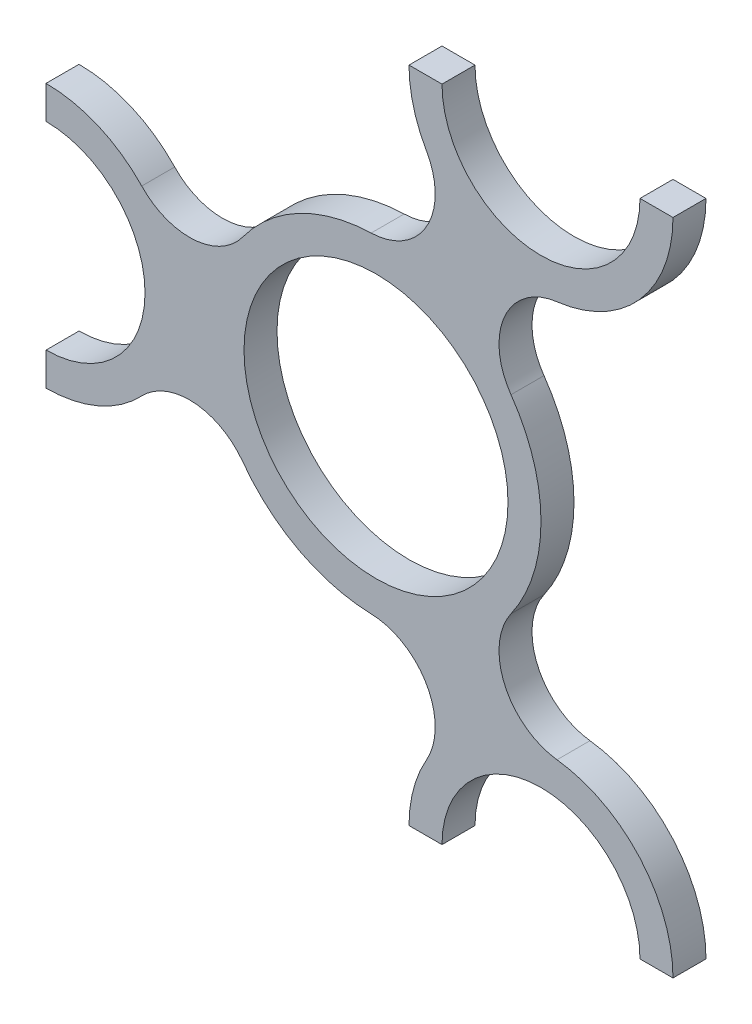
ISO-10303-21;
HEADER;
FILE_DESCRIPTION(('STEP AP214'),'2;1');
FILE_NAME('part.step','',(''),(''),'','','');
FILE_SCHEMA(('AUTOMOTIVE_DESIGN { 1 0 10303 214 1 1 1 1 }'));
ENDSEC;
DATA;
#1=APPLICATION_CONTEXT('core data for automotive mechanical design processes');
#2=APPLICATION_PROTOCOL_DEFINITION('international standard','automotive_design',2000,#1);
#3=PRODUCT_CONTEXT('',#1,'mechanical');
#4=PRODUCT('Part','Part','',(#3));
#5=PRODUCT_RELATED_PRODUCT_CATEGORY('part','',(#4));
#6=PRODUCT_DEFINITION_FORMATION('','',#4);
#7=PRODUCT_DEFINITION_CONTEXT('part definition',#1,'design');
#8=PRODUCT_DEFINITION('design','',#6,#7);
#9=PRODUCT_DEFINITION_SHAPE('','',#8);
#10=(LENGTH_UNIT() NAMED_UNIT(*) SI_UNIT(.MILLI.,.METRE.));
#11=(NAMED_UNIT(*) PLANE_ANGLE_UNIT() SI_UNIT($,.RADIAN.));
#12=(NAMED_UNIT(*) SI_UNIT($,.STERADIAN.) SOLID_ANGLE_UNIT());
#13=UNCERTAINTY_MEASURE_WITH_UNIT(LENGTH_MEASURE(1.E-05),#10,'distance_accuracy_value','');
#14=(GEOMETRIC_REPRESENTATION_CONTEXT(3) GLOBAL_UNCERTAINTY_ASSIGNED_CONTEXT((#13)) GLOBAL_UNIT_ASSIGNED_CONTEXT((#10,
#11,#12)) REPRESENTATION_CONTEXT('',''));
#15=CARTESIAN_POINT('',(0.,0.,0.));
#16=DIRECTION('',(0.,0.,1.));
#17=DIRECTION('',(1.,0.,0.));
#18=AXIS2_PLACEMENT_3D('',#15,#16,#17);
#19=CARTESIAN_POINT('',(-100.,0.,10.));
#20=DIRECTION('',(0.,0.,1.));
#21=DIRECTION('',(1.,0.,0.));
#22=AXIS2_PLACEMENT_3D('',#19,#20,#21);
#23=PLANE('',#22);
#24=CARTESIAN_POINT('',(-100.,0.,10.));
#25=DIRECTION('',(0.,0.,-1.));
#26=DIRECTION('',(1.,0.,0.));
#27=AXIS2_PLACEMENT_3D('',#24,#25,#26);
#28=CIRCLE('',#27,30.);
#29=CARTESIAN_POINT('',(-100.,30.,10.));
#30=VERTEX_POINT('',#29);
#31=CARTESIAN_POINT('',(-99.9999999999997,-30.,10.));
#32=VERTEX_POINT('',#31);
#33=EDGE_CURVE('E279',#30,#32,#28,.T.);
#34=ORIENTED_EDGE('',*,*,#33,.T.);
#35=DIRECTION('',(0.,-1.,0.));
#36=VECTOR('',#35,1.);
#37=CARTESIAN_POINT('',(-99.9999999999996,-40.,10.));
#38=LINE('',#37,#36);
#39=CARTESIAN_POINT('',(-99.9999999999996,-40.,10.));
#40=VERTEX_POINT('',#39);
#41=EDGE_CURVE('E147',#32,#40,#38,.T.);
#42=ORIENTED_EDGE('',*,*,#41,.T.);
#43=CARTESIAN_POINT('',(-100.,0.,10.));
#44=DIRECTION('',(0.,0.,1.));
#45=DIRECTION('',(1.,0.,0.));
#46=AXIS2_PLACEMENT_3D('',#43,#44,#45);
#47=CIRCLE('',#46,40.);
#48=CARTESIAN_POINT('',(-71.,-27.5499546279118,10.));
#49=VERTEX_POINT('',#48);
#50=EDGE_CURVE('E342',#40,#49,#47,.T.);
#51=ORIENTED_EDGE('',*,*,#50,.T.);
#52=CARTESIAN_POINT('',(-56.5,-41.3249319418677,10.));
#53=DIRECTION('',(0.,0.,-1.));
#54=DIRECTION('',(1.,0.,0.));
#55=AXIS2_PLACEMENT_3D('',#52,#53,#54);
#56=CIRCLE('',#55,20.);
#57=CARTESIAN_POINT('',(-40.3571428571429,-29.5178085299055,10.));
#58=VERTEX_POINT('',#57);
#59=EDGE_CURVE('E361',#49,#58,#56,.T.);
#60=ORIENTED_EDGE('',*,*,#59,.T.);
#61=CARTESIAN_POINT('',(0.,0.,10.));
#62=DIRECTION('',(0.,0.,1.));
#63=DIRECTION('',(1.,0.,0.));
#64=AXIS2_PLACEMENT_3D('',#61,#62,#63);
#65=CIRCLE('',#64,50.);
#66=CARTESIAN_POINT('',(-1.47081145952459,-49.9783624546716,10.));
#67=VERTEX_POINT('',#66);
#68=EDGE_CURVE('E358',#58,#67,#65,.T.);
#69=ORIENTED_EDGE('',*,*,#68,.T.);
#70=CARTESIAN_POINT('',(-2.0591360433344,-69.9697074365403,10.));
#71=DIRECTION('',(0.,0.,-1.));
#72=DIRECTION('',(1.,0.,0.));
#73=AXIS2_PLACEMENT_3D('',#70,#71,#72);
#74=CIRCLE('',#73,20.);
#75=CARTESIAN_POINT('',(15.2939093044437,-79.9131382910269,10.));
#76=VERTEX_POINT('',#75);
#77=EDGE_CURVE('E360',#67,#76,#74,.T.);
#78=ORIENTED_EDGE('',*,*,#77,.T.);
#79=CARTESIAN_POINT('',(50.,-99.8,10.));
#80=DIRECTION('',(0.,0.,1.));
#81=DIRECTION('',(1.,0.,0.));
#82=AXIS2_PLACEMENT_3D('',#79,#80,#81);
#83=CIRCLE('',#82,40.);
#84=CARTESIAN_POINT('',(10.,-99.8000000000003,10.));
#85=VERTEX_POINT('',#84);
#86=EDGE_CURVE('E363',#76,#85,#83,.T.);
#87=ORIENTED_EDGE('',*,*,#86,.T.);
#88=DIRECTION('',(1.,0.,0.));
#89=VECTOR('',#88,1.);
#90=CARTESIAN_POINT('',(10.,-99.8000000000003,10.));
#91=LINE('',#90,#89);
#92=CARTESIAN_POINT('',(20.,-99.8000000000002,10.));
#93=VERTEX_POINT('',#92);
#94=EDGE_CURVE('E369',#85,#93,#91,.T.);
#95=ORIENTED_EDGE('',*,*,#94,.T.);
#96=CARTESIAN_POINT('',(50.,-99.8,10.));
#97=DIRECTION('',(0.,0.,-1.));
#98=DIRECTION('',(1.,0.,0.));
#99=AXIS2_PLACEMENT_3D('',#96,#97,#98);
#100=CIRCLE('',#99,30.);
#101=CARTESIAN_POINT('',(80.,-99.8000000000001,10.));
#102=VERTEX_POINT('',#101);
#103=EDGE_CURVE('E371',#93,#102,#100,.T.);
#104=ORIENTED_EDGE('',*,*,#103,.T.);
#105=DIRECTION('',(1.,0.,0.));
#106=VECTOR('',#105,1.);
#107=CARTESIAN_POINT('',(80.,-99.8,10.));
#108=LINE('',#107,#106);
#109=CARTESIAN_POINT('',(90.,-99.8,10.));
#110=VERTEX_POINT('',#109);
#111=EDGE_CURVE('E373',#102,#110,#108,.T.);
#112=ORIENTED_EDGE('',*,*,#111,.T.);
#113=CARTESIAN_POINT('',(50.,-99.8,10.));
#114=DIRECTION('',(0.,0.,1.));
#115=DIRECTION('',(1.,0.,0.));
#116=AXIS2_PLACEMENT_3D('',#113,#114,#115);
#117=CIRCLE('',#116,40.);
#118=CARTESIAN_POINT('',(54.850541810213,-60.0951861338278,10.));
#119=VERTEX_POINT('',#118);
#120=EDGE_CURVE('E375',#110,#119,#117,.T.);
#121=ORIENTED_EDGE('',*,*,#120,.T.);
#122=CARTESIAN_POINT('',(57.2758127153194,-40.2427792007418,10.));
#123=DIRECTION('',(0.,0.,-1.));
#124=DIRECTION('',(1.,0.,0.));
#125=AXIS2_PLACEMENT_3D('',#122,#123,#124);
#126=CIRCLE('',#125,20.);
#127=CARTESIAN_POINT('',(40.9112947966567,-28.7448422862441,10.));
#128=VERTEX_POINT('',#127);
#129=EDGE_CURVE('E377',#119,#128,#126,.T.);
#130=ORIENTED_EDGE('',*,*,#129,.T.);
#131=CARTESIAN_POINT('',(0.,0.,10.));
#132=DIRECTION('',(0.,0.,1.));
#133=DIRECTION('',(1.,0.,0.));
#134=AXIS2_PLACEMENT_3D('',#131,#132,#133);
#135=CIRCLE('',#134,50.);
#136=CARTESIAN_POINT('',(40.9112947966567,28.7448422862441,10.));
#137=VERTEX_POINT('',#136);
#138=EDGE_CURVE('E379',#128,#137,#135,.T.);
#139=ORIENTED_EDGE('',*,*,#138,.T.);
#140=CARTESIAN_POINT('',(57.2758127153194,40.2427792007418,10.));
#141=DIRECTION('',(0.,0.,-1.));
#142=DIRECTION('',(-1.,0.,0.));
#143=AXIS2_PLACEMENT_3D('',#140,#141,#142);
#144=CIRCLE('',#143,20.);
#145=CARTESIAN_POINT('',(54.8505418102129,60.0951861338278,10.));
#146=VERTEX_POINT('',#145);
#147=EDGE_CURVE('E381',#137,#146,#144,.T.);
#148=ORIENTED_EDGE('',*,*,#147,.T.);
#149=CARTESIAN_POINT('',(50.,99.8,10.));
#150=DIRECTION('',(0.,0.,1.));
#151=DIRECTION('',(1.,0.,0.));
#152=AXIS2_PLACEMENT_3D('',#149,#150,#151);
#153=CIRCLE('',#152,40.);
#154=CARTESIAN_POINT('',(90.,99.8,10.));
#155=VERTEX_POINT('',#154);
#156=EDGE_CURVE('E383',#146,#155,#153,.T.);
#157=ORIENTED_EDGE('',*,*,#156,.T.);
#158=DIRECTION('',(-1.,0.,0.));
#159=VECTOR('',#158,1.);
#160=CARTESIAN_POINT('',(80.,99.8,10.));
#161=LINE('',#160,#159);
#162=CARTESIAN_POINT('',(80.,99.8,10.));
#163=VERTEX_POINT('',#162);
#164=EDGE_CURVE('E385',#155,#163,#161,.T.);
#165=ORIENTED_EDGE('',*,*,#164,.T.);
#166=CARTESIAN_POINT('',(50.,99.8,10.));
#167=DIRECTION('',(0.,0.,-1.));
#168=DIRECTION('',(1.,0.,0.));
#169=AXIS2_PLACEMENT_3D('',#166,#167,#168);
#170=CIRCLE('',#169,30.);
#171=CARTESIAN_POINT('',(20.,99.7999999999998,10.));
#172=VERTEX_POINT('',#171);
#173=EDGE_CURVE('E387',#163,#172,#170,.T.);
#174=ORIENTED_EDGE('',*,*,#173,.T.);
#175=DIRECTION('',(-1.,0.,0.));
#176=VECTOR('',#175,1.);
#177=CARTESIAN_POINT('',(10.,99.7999999999997,10.));
#178=LINE('',#177,#176);
#179=CARTESIAN_POINT('',(10.,99.7999999999997,10.));
#180=VERTEX_POINT('',#179);
#181=EDGE_CURVE('E389',#172,#180,#178,.T.);
#182=ORIENTED_EDGE('',*,*,#181,.T.);
#183=CARTESIAN_POINT('',(50.,99.8,10.));
#184=DIRECTION('',(0.,0.,1.));
#185=DIRECTION('',(1.,0.,0.));
#186=AXIS2_PLACEMENT_3D('',#183,#184,#185);
#187=CIRCLE('',#186,40.);
#188=CARTESIAN_POINT('',(15.2939093044437,79.9131382910269,10.));
#189=VERTEX_POINT('',#188);
#190=EDGE_CURVE('E391',#180,#189,#187,.T.);
#191=ORIENTED_EDGE('',*,*,#190,.T.);
#192=CARTESIAN_POINT('',(-2.0591360433344,69.9697074365403,10.));
#193=DIRECTION('',(0.,0.,-1.));
#194=DIRECTION('',(1.,0.,0.));
#195=AXIS2_PLACEMENT_3D('',#192,#193,#194);
#196=CIRCLE('',#195,20.);
#197=CARTESIAN_POINT('',(-1.47081145952457,49.9783624546716,10.));
#198=VERTEX_POINT('',#197);
#199=EDGE_CURVE('E393',#189,#198,#196,.T.);
#200=ORIENTED_EDGE('',*,*,#199,.T.);
#201=CARTESIAN_POINT('',(0.,0.,10.));
#202=DIRECTION('',(0.,0.,1.));
#203=DIRECTION('',(1.,0.,0.));
#204=AXIS2_PLACEMENT_3D('',#201,#202,#203);
#205=CIRCLE('',#204,50.);
#206=CARTESIAN_POINT('',(-40.3571428571429,29.5178085299055,10.));
#207=VERTEX_POINT('',#206);
#208=EDGE_CURVE('E214',#198,#207,#205,.T.);
#209=ORIENTED_EDGE('',*,*,#208,.T.);
#210=CARTESIAN_POINT('',(-56.5,41.3249319418677,10.));
#211=DIRECTION('',(0.,0.,-1.));
#212=DIRECTION('',(1.,0.,0.));
#213=AXIS2_PLACEMENT_3D('',#210,#211,#212);
#214=CIRCLE('',#213,20.);
#215=CARTESIAN_POINT('',(-71.,27.5499546279118,10.));
#216=VERTEX_POINT('',#215);
#217=EDGE_CURVE('E208',#207,#216,#214,.T.);
#218=ORIENTED_EDGE('',*,*,#217,.T.);
#219=CARTESIAN_POINT('',(-100.,0.,10.));
#220=DIRECTION('',(0.,0.,1.));
#221=DIRECTION('',(1.,0.,0.));
#222=AXIS2_PLACEMENT_3D('',#219,#220,#221);
#223=CIRCLE('',#222,40.);
#224=CARTESIAN_POINT('',(-100.,40.,10.));
#225=VERTEX_POINT('',#224);
#226=EDGE_CURVE('E212',#216,#225,#223,.T.);
#227=ORIENTED_EDGE('',*,*,#226,.T.);
#228=DIRECTION('',(0.,-1.,0.));
#229=VECTOR('',#228,1.);
#230=CARTESIAN_POINT('',(-100.,30.,10.));
#231=LINE('',#230,#229);
#232=EDGE_CURVE('E56',#225,#30,#231,.T.);
#233=ORIENTED_EDGE('',*,*,#232,.T.);
#234=EDGE_LOOP('',(#34,#42,#51,#60,#69,#78,#87,#95,#104,#112,#121,#130,#139,#148,#157,#165,#174,
#182,#191,#200,#209,#218,#227,#233));
#235=FACE_BOUND('',#234,.T.);
#236=CARTESIAN_POINT('',(0.,0.,10.));
#237=DIRECTION('',(0.,0.,1.));
#238=DIRECTION('',(1.,0.,0.));
#239=AXIS2_PLACEMENT_3D('',#236,#237,#238);
#240=CIRCLE('',#239,40.);
#241=CARTESIAN_POINT('',(40.,0.,10.));
#242=VERTEX_POINT('',#241);
#243=EDGE_CURVE('E236',#242,#242,#240,.T.);
#244=ORIENTED_EDGE('',*,*,#243,.F.);
#245=EDGE_LOOP('',(#244));
#246=FACE_BOUND('',#245,.T.);
#247=ADVANCED_FACE('F39',(#235,#246),#23,.T.);
#248=CARTESIAN_POINT('',(-100.,0.,0.));
#249=DIRECTION('',(0.,0.,1.));
#250=DIRECTION('',(1.,0.,0.));
#251=AXIS2_PLACEMENT_3D('',#248,#249,#250);
#252=PLANE('',#251);
#253=CARTESIAN_POINT('',(-100.,0.,0.));
#254=DIRECTION('',(0.,0.,-1.));
#255=DIRECTION('',(1.,0.,0.));
#256=AXIS2_PLACEMENT_3D('',#253,#254,#255);
#257=CIRCLE('',#256,30.);
#258=CARTESIAN_POINT('',(-100.,30.,0.));
#259=VERTEX_POINT('',#258);
#260=CARTESIAN_POINT('',(-99.9999999999997,-30.,0.));
#261=VERTEX_POINT('',#260);
#262=EDGE_CURVE('E232',#259,#261,#257,.T.);
#263=ORIENTED_EDGE('',*,*,#262,.F.);
#264=DIRECTION('',(0.,-1.,0.));
#265=VECTOR('',#264,1.);
#266=CARTESIAN_POINT('',(-100.,30.,0.));
#267=LINE('',#266,#265);
#268=CARTESIAN_POINT('',(-100.,40.,0.));
#269=VERTEX_POINT('',#268);
#270=EDGE_CURVE('E139',#269,#259,#267,.T.);
#271=ORIENTED_EDGE('',*,*,#270,.F.);
#272=CARTESIAN_POINT('',(-100.,0.,0.));
#273=DIRECTION('',(0.,0.,1.));
#274=DIRECTION('',(1.,0.,0.));
#275=AXIS2_PLACEMENT_3D('',#272,#273,#274);
#276=CIRCLE('',#275,40.);
#277=CARTESIAN_POINT('',(-71.,27.5499546279118,0.));
#278=VERTEX_POINT('',#277);
#279=EDGE_CURVE('E133',#278,#269,#276,.T.);
#280=ORIENTED_EDGE('',*,*,#279,.F.);
#281=CARTESIAN_POINT('',(-56.5,41.3249319418677,0.));
#282=DIRECTION('',(0.,0.,-1.));
#283=DIRECTION('',(1.,0.,0.));
#284=AXIS2_PLACEMENT_3D('',#281,#282,#283);
#285=CIRCLE('',#284,20.);
#286=CARTESIAN_POINT('',(-40.3571428571429,29.5178085299055,0.));
#287=VERTEX_POINT('',#286);
#288=EDGE_CURVE('E222',#287,#278,#285,.T.);
#289=ORIENTED_EDGE('',*,*,#288,.F.);
#290=CARTESIAN_POINT('',(0.,0.,0.));
#291=DIRECTION('',(0.,0.,1.));
#292=DIRECTION('',(1.,0.,0.));
#293=AXIS2_PLACEMENT_3D('',#290,#291,#292);
#294=CIRCLE('',#293,50.);
#295=CARTESIAN_POINT('',(-1.47081145952457,49.9783624546716,0.));
#296=VERTEX_POINT('',#295);
#297=EDGE_CURVE('E274',#296,#287,#294,.T.);
#298=ORIENTED_EDGE('',*,*,#297,.F.);
#299=CARTESIAN_POINT('',(-2.0591360433344,69.9697074365403,0.));
#300=DIRECTION('',(0.,0.,-1.));
#301=DIRECTION('',(1.,0.,0.));
#302=AXIS2_PLACEMENT_3D('',#299,#300,#301);
#303=CIRCLE('',#302,20.);
#304=CARTESIAN_POINT('',(15.2939093044437,79.9131382910269,0.));
#305=VERTEX_POINT('',#304);
#306=EDGE_CURVE('E272',#305,#296,#303,.T.);
#307=ORIENTED_EDGE('',*,*,#306,.F.);
#308=CARTESIAN_POINT('',(50.,99.8,0.));
#309=DIRECTION('',(0.,0.,1.));
#310=DIRECTION('',(1.,0.,0.));
#311=AXIS2_PLACEMENT_3D('',#308,#309,#310);
#312=CIRCLE('',#311,40.);
#313=CARTESIAN_POINT('',(10.,99.7999999999997,0.));
#314=VERTEX_POINT('',#313);
#315=EDGE_CURVE('E270',#314,#305,#312,.T.);
#316=ORIENTED_EDGE('',*,*,#315,.F.);
#317=DIRECTION('',(-1.,0.,0.));
#318=VECTOR('',#317,1.);
#319=CARTESIAN_POINT('',(10.,99.7999999999997,0.));
#320=LINE('',#319,#318);
#321=CARTESIAN_POINT('',(20.,99.7999999999998,0.));
#322=VERTEX_POINT('',#321);
#323=EDGE_CURVE('E268',#322,#314,#320,.T.);
#324=ORIENTED_EDGE('',*,*,#323,.F.);
#325=CARTESIAN_POINT('',(50.,99.8,0.));
#326=DIRECTION('',(0.,0.,-1.));
#327=DIRECTION('',(1.,0.,0.));
#328=AXIS2_PLACEMENT_3D('',#325,#326,#327);
#329=CIRCLE('',#328,30.);
#330=CARTESIAN_POINT('',(80.,99.8,0.));
#331=VERTEX_POINT('',#330);
#332=EDGE_CURVE('E266',#331,#322,#329,.T.);
#333=ORIENTED_EDGE('',*,*,#332,.F.);
#334=DIRECTION('',(-1.,0.,0.));
#335=VECTOR('',#334,1.);
#336=CARTESIAN_POINT('',(80.,99.8,0.));
#337=LINE('',#336,#335);
#338=CARTESIAN_POINT('',(90.,99.8,0.));
#339=VERTEX_POINT('',#338);
#340=EDGE_CURVE('E264',#339,#331,#337,.T.);
#341=ORIENTED_EDGE('',*,*,#340,.F.);
#342=CARTESIAN_POINT('',(50.,99.8,0.));
#343=DIRECTION('',(0.,0.,1.));
#344=DIRECTION('',(1.,0.,0.));
#345=AXIS2_PLACEMENT_3D('',#342,#343,#344);
#346=CIRCLE('',#345,40.);
#347=CARTESIAN_POINT('',(54.8505418102129,60.0951861338278,0.));
#348=VERTEX_POINT('',#347);
#349=EDGE_CURVE('E262',#348,#339,#346,.T.);
#350=ORIENTED_EDGE('',*,*,#349,.F.);
#351=CARTESIAN_POINT('',(57.2758127153194,40.2427792007418,0.));
#352=DIRECTION('',(0.,0.,-1.));
#353=DIRECTION('',(-1.,0.,0.));
#354=AXIS2_PLACEMENT_3D('',#351,#352,#353);
#355=CIRCLE('',#354,20.);
#356=CARTESIAN_POINT('',(40.9112947966567,28.7448422862441,0.));
#357=VERTEX_POINT('',#356);
#358=EDGE_CURVE('E260',#357,#348,#355,.T.);
#359=ORIENTED_EDGE('',*,*,#358,.F.);
#360=CARTESIAN_POINT('',(0.,0.,0.));
#361=DIRECTION('',(0.,0.,1.));
#362=DIRECTION('',(1.,0.,0.));
#363=AXIS2_PLACEMENT_3D('',#360,#361,#362);
#364=CIRCLE('',#363,50.);
#365=CARTESIAN_POINT('',(40.9112947966567,-28.7448422862441,0.));
#366=VERTEX_POINT('',#365);
#367=EDGE_CURVE('E258',#366,#357,#364,.T.);
#368=ORIENTED_EDGE('',*,*,#367,.F.);
#369=CARTESIAN_POINT('',(57.2758127153194,-40.2427792007418,0.));
#370=DIRECTION('',(0.,0.,-1.));
#371=DIRECTION('',(1.,0.,0.));
#372=AXIS2_PLACEMENT_3D('',#369,#370,#371);
#373=CIRCLE('',#372,20.);
#374=CARTESIAN_POINT('',(54.850541810213,-60.0951861338278,0.));
#375=VERTEX_POINT('',#374);
#376=EDGE_CURVE('E256',#375,#366,#373,.T.);
#377=ORIENTED_EDGE('',*,*,#376,.F.);
#378=CARTESIAN_POINT('',(50.,-99.8,0.));
#379=DIRECTION('',(0.,0.,1.));
#380=DIRECTION('',(1.,0.,0.));
#381=AXIS2_PLACEMENT_3D('',#378,#379,#380);
#382=CIRCLE('',#381,40.);
#383=CARTESIAN_POINT('',(90.,-99.8,0.));
#384=VERTEX_POINT('',#383);
#385=EDGE_CURVE('E254',#384,#375,#382,.T.);
#386=ORIENTED_EDGE('',*,*,#385,.F.);
#387=DIRECTION('',(1.,0.,0.));
#388=VECTOR('',#387,1.);
#389=CARTESIAN_POINT('',(80.,-99.8,0.));
#390=LINE('',#389,#388);
#391=CARTESIAN_POINT('',(80.,-99.8000000000001,0.));
#392=VERTEX_POINT('',#391);
#393=EDGE_CURVE('E252',#392,#384,#390,.T.);
#394=ORIENTED_EDGE('',*,*,#393,.F.);
#395=CARTESIAN_POINT('',(50.,-99.8,0.));
#396=DIRECTION('',(0.,0.,-1.));
#397=DIRECTION('',(1.,0.,0.));
#398=AXIS2_PLACEMENT_3D('',#395,#396,#397);
#399=CIRCLE('',#398,30.);
#400=CARTESIAN_POINT('',(20.,-99.8000000000002,0.));
#401=VERTEX_POINT('',#400);
#402=EDGE_CURVE('E250',#401,#392,#399,.T.);
#403=ORIENTED_EDGE('',*,*,#402,.F.);
#404=DIRECTION('',(1.,0.,0.));
#405=VECTOR('',#404,1.);
#406=CARTESIAN_POINT('',(10.,-99.8000000000003,0.));
#407=LINE('',#406,#405);
#408=CARTESIAN_POINT('',(10.,-99.8000000000003,0.));
#409=VERTEX_POINT('',#408);
#410=EDGE_CURVE('E248',#409,#401,#407,.T.);
#411=ORIENTED_EDGE('',*,*,#410,.F.);
#412=CARTESIAN_POINT('',(50.,-99.8,0.));
#413=DIRECTION('',(0.,0.,1.));
#414=DIRECTION('',(1.,0.,0.));
#415=AXIS2_PLACEMENT_3D('',#412,#413,#414);
#416=CIRCLE('',#415,40.);
#417=CARTESIAN_POINT('',(15.2939093044437,-79.9131382910269,0.));
#418=VERTEX_POINT('',#417);
#419=EDGE_CURVE('E246',#418,#409,#416,.T.);
#420=ORIENTED_EDGE('',*,*,#419,.F.);
#421=CARTESIAN_POINT('',(-2.0591360433344,-69.9697074365403,0.));
#422=DIRECTION('',(0.,0.,-1.));
#423=DIRECTION('',(1.,0.,0.));
#424=AXIS2_PLACEMENT_3D('',#421,#422,#423);
#425=CIRCLE('',#424,20.);
#426=CARTESIAN_POINT('',(-1.47081145952459,-49.9783624546716,0.));
#427=VERTEX_POINT('',#426);
#428=EDGE_CURVE('E244',#427,#418,#425,.T.);
#429=ORIENTED_EDGE('',*,*,#428,.F.);
#430=CARTESIAN_POINT('',(0.,0.,0.));
#431=DIRECTION('',(0.,0.,1.));
#432=DIRECTION('',(1.,0.,0.));
#433=AXIS2_PLACEMENT_3D('',#430,#431,#432);
#434=CIRCLE('',#433,50.);
#435=CARTESIAN_POINT('',(-40.3571428571429,-29.5178085299055,0.));
#436=VERTEX_POINT('',#435);
#437=EDGE_CURVE('E242',#436,#427,#434,.T.);
#438=ORIENTED_EDGE('',*,*,#437,.F.);
#439=CARTESIAN_POINT('',(-56.5,-41.3249319418677,0.));
#440=DIRECTION('',(0.,0.,-1.));
#441=DIRECTION('',(1.,0.,0.));
#442=AXIS2_PLACEMENT_3D('',#439,#440,#441);
#443=CIRCLE('',#442,20.);
#444=CARTESIAN_POINT('',(-71.,-27.5499546279118,0.));
#445=VERTEX_POINT('',#444);
#446=EDGE_CURVE('E240',#445,#436,#443,.T.);
#447=ORIENTED_EDGE('',*,*,#446,.F.);
#448=CARTESIAN_POINT('',(-100.,0.,0.));
#449=DIRECTION('',(0.,0.,1.));
#450=DIRECTION('',(1.,0.,0.));
#451=AXIS2_PLACEMENT_3D('',#448,#449,#450);
#452=CIRCLE('',#451,40.);
#453=CARTESIAN_POINT('',(-99.9999999999996,-40.,0.));
#454=VERTEX_POINT('',#453);
#455=EDGE_CURVE('E238',#454,#445,#452,.T.);
#456=ORIENTED_EDGE('',*,*,#455,.F.);
#457=DIRECTION('',(0.,-1.,0.));
#458=VECTOR('',#457,1.);
#459=CARTESIAN_POINT('',(-99.9999999999996,-40.,0.));
#460=LINE('',#459,#458);
#461=EDGE_CURVE('E235',#261,#454,#460,.T.);
#462=ORIENTED_EDGE('',*,*,#461,.F.);
#463=EDGE_LOOP('',(#263,#271,#280,#289,#298,#307,#316,#324,#333,#341,#350,#359,#368,#377,#386,
#394,#403,#411,#420,#429,#438,#447,#456,#462));
#464=FACE_BOUND('',#463,.T.);
#465=CARTESIAN_POINT('',(0.,0.,0.));
#466=DIRECTION('',(0.,0.,1.));
#467=DIRECTION('',(1.,0.,0.));
#468=AXIS2_PLACEMENT_3D('',#465,#466,#467);
#469=CIRCLE('',#468,40.);
#470=CARTESIAN_POINT('',(40.,0.,0.));
#471=VERTEX_POINT('',#470);
#472=EDGE_CURVE('E696',#471,#471,#469,.T.);
#473=ORIENTED_EDGE('',*,*,#472,.T.);
#474=EDGE_LOOP('',(#473));
#475=FACE_BOUND('',#474,.T.);
#476=ADVANCED_FACE('F346',(#464,#475),#252,.F.);
#477=CARTESIAN_POINT('',(-100.,0.,10.));
#478=DIRECTION('',(0.,0.,-1.));
#479=DIRECTION('',(-1.,0.,0.));
#480=AXIS2_PLACEMENT_3D('',#477,#478,#479);
#481=CYLINDRICAL_SURFACE('',#480,30.);
#482=ORIENTED_EDGE('',*,*,#262,.T.);
#483=DIRECTION('',(0.,0.,-1.));
#484=VECTOR('',#483,1.);
#485=CARTESIAN_POINT('',(-99.9999999999997,-30.,10.));
#486=LINE('',#485,#484);
#487=EDGE_CURVE('E11',#32,#261,#486,.T.);
#488=ORIENTED_EDGE('',*,*,#487,.F.);
#489=ORIENTED_EDGE('',*,*,#33,.F.);
#490=DIRECTION('',(0.,0.,-1.));
#491=VECTOR('',#490,1.);
#492=CARTESIAN_POINT('',(-100.,30.,10.));
#493=LINE('',#492,#491);
#494=EDGE_CURVE('E228',#30,#259,#493,.T.);
#495=ORIENTED_EDGE('',*,*,#494,.T.);
#496=EDGE_LOOP('',(#482,#488,#489,#495));
#497=FACE_BOUND('',#496,.T.);
#498=ADVANCED_FACE('F41',(#497),#481,.F.);
#499=CARTESIAN_POINT('',(-99.9999999999996,-40.,10.));
#500=DIRECTION('',(1.,0.,0.));
#501=DIRECTION('',(0.,1.,0.));
#502=AXIS2_PLACEMENT_3D('',#499,#500,#501);
#503=PLANE('',#502);
#504=ORIENTED_EDGE('',*,*,#461,.T.);
#505=DIRECTION('',(0.,0.,-1.));
#506=VECTOR('',#505,1.);
#507=CARTESIAN_POINT('',(-99.9999999999996,-40.,10.));
#508=LINE('',#507,#506);
#509=EDGE_CURVE('E48',#40,#454,#508,.T.);
#510=ORIENTED_EDGE('',*,*,#509,.F.);
#511=ORIENTED_EDGE('',*,*,#41,.F.);
#512=ORIENTED_EDGE('',*,*,#487,.T.);
#513=EDGE_LOOP('',(#504,#510,#511,#512));
#514=FACE_BOUND('',#513,.T.);
#515=ADVANCED_FACE('F427',(#514),#503,.F.);
#516=CARTESIAN_POINT('',(-100.,0.,10.));
#517=DIRECTION('',(0.,0.,-1.));
#518=DIRECTION('',(-1.,0.,0.));
#519=AXIS2_PLACEMENT_3D('',#516,#517,#518);
#520=CYLINDRICAL_SURFACE('',#519,40.);
#521=ORIENTED_EDGE('',*,*,#455,.T.);
#522=DIRECTION('',(0.,0.,-1.));
#523=VECTOR('',#522,1.);
#524=CARTESIAN_POINT('',(-71.,-27.5499546279118,10.));
#525=LINE('',#524,#523);
#526=EDGE_CURVE('E334',#49,#445,#525,.T.);
#527=ORIENTED_EDGE('',*,*,#526,.F.);
#528=ORIENTED_EDGE('',*,*,#50,.F.);
#529=ORIENTED_EDGE('',*,*,#509,.T.);
#530=EDGE_LOOP('',(#521,#527,#528,#529));
#531=FACE_BOUND('',#530,.T.);
#532=ADVANCED_FACE('F340',(#531),#520,.T.);
#533=CARTESIAN_POINT('',(-56.5,-41.3249319418677,10.));
#534=DIRECTION('',(0.,0.,-1.));
#535=DIRECTION('',(-1.,0.,0.));
#536=AXIS2_PLACEMENT_3D('',#533,#534,#535);
#537=CYLINDRICAL_SURFACE('',#536,20.);
#538=ORIENTED_EDGE('',*,*,#446,.T.);
#539=DIRECTION('',(0.,0.,-1.));
#540=VECTOR('',#539,1.);
#541=CARTESIAN_POINT('',(-40.3571428571429,-29.5178085299055,10.));
#542=LINE('',#541,#540);
#543=EDGE_CURVE('E331',#58,#436,#542,.T.);
#544=ORIENTED_EDGE('',*,*,#543,.F.);
#545=ORIENTED_EDGE('',*,*,#59,.F.);
#546=ORIENTED_EDGE('',*,*,#526,.T.);
#547=EDGE_LOOP('',(#538,#544,#545,#546));
#548=FACE_BOUND('',#547,.T.);
#549=ADVANCED_FACE('F352',(#548),#537,.F.);
#550=CARTESIAN_POINT('',(0.,0.,10.));
#551=DIRECTION('',(0.,0.,-1.));
#552=DIRECTION('',(-1.,0.,0.));
#553=AXIS2_PLACEMENT_3D('',#550,#551,#552);
#554=CYLINDRICAL_SURFACE('',#553,50.);
#555=ORIENTED_EDGE('',*,*,#437,.T.);
#556=DIRECTION('',(0.,0.,-1.));
#557=VECTOR('',#556,1.);
#558=CARTESIAN_POINT('',(-1.47081145952459,-49.9783624546716,10.));
#559=LINE('',#558,#557);
#560=EDGE_CURVE('E328',#67,#427,#559,.T.);
#561=ORIENTED_EDGE('',*,*,#560,.F.);
#562=ORIENTED_EDGE('',*,*,#68,.F.);
#563=ORIENTED_EDGE('',*,*,#543,.T.);
#564=EDGE_LOOP('',(#555,#561,#562,#563));
#565=FACE_BOUND('',#564,.T.);
#566=ADVANCED_FACE('F356',(#565),#554,.T.);
#567=CARTESIAN_POINT('',(-2.0591360433344,-69.9697074365403,10.));
#568=DIRECTION('',(0.,0.,-1.));
#569=DIRECTION('',(-1.,0.,0.));
#570=AXIS2_PLACEMENT_3D('',#567,#568,#569);
#571=CYLINDRICAL_SURFACE('',#570,20.);
#572=ORIENTED_EDGE('',*,*,#428,.T.);
#573=DIRECTION('',(0.,0.,-1.));
#574=VECTOR('',#573,1.);
#575=CARTESIAN_POINT('',(15.2939093044437,-79.9131382910269,10.));
#576=LINE('',#575,#574);
#577=EDGE_CURVE('E325',#76,#418,#576,.T.);
#578=ORIENTED_EDGE('',*,*,#577,.F.);
#579=ORIENTED_EDGE('',*,*,#77,.F.);
#580=ORIENTED_EDGE('',*,*,#560,.T.);
#581=EDGE_LOOP('',(#572,#578,#579,#580));
#582=FACE_BOUND('',#581,.T.);
#583=ADVANCED_FACE('F440',(#582),#571,.F.);
#584=CARTESIAN_POINT('',(50.,-99.8,10.));
#585=DIRECTION('',(0.,0.,-1.));
#586=DIRECTION('',(-1.,0.,0.));
#587=AXIS2_PLACEMENT_3D('',#584,#585,#586);
#588=CYLINDRICAL_SURFACE('',#587,40.);
#589=ORIENTED_EDGE('',*,*,#419,.T.);
#590=DIRECTION('',(0.,0.,-1.));
#591=VECTOR('',#590,1.);
#592=CARTESIAN_POINT('',(10.,-99.8000000000003,10.));
#593=LINE('',#592,#591);
#594=EDGE_CURVE('E322',#85,#409,#593,.T.);
#595=ORIENTED_EDGE('',*,*,#594,.F.);
#596=ORIENTED_EDGE('',*,*,#86,.F.);
#597=ORIENTED_EDGE('',*,*,#577,.T.);
#598=EDGE_LOOP('',(#589,#595,#596,#597));
#599=FACE_BOUND('',#598,.T.);
#600=ADVANCED_FACE('F443',(#599),#588,.T.);
#601=CARTESIAN_POINT('',(10.,-99.8000000000003,10.));
#602=DIRECTION('',(0.,1.,0.));
#603=DIRECTION('',(-1.,0.,0.));
#604=AXIS2_PLACEMENT_3D('',#601,#602,#603);
#605=PLANE('',#604);
#606=ORIENTED_EDGE('',*,*,#410,.T.);
#607=DIRECTION('',(0.,0.,-1.));
#608=VECTOR('',#607,1.);
#609=CARTESIAN_POINT('',(20.,-99.8000000000002,10.));
#610=LINE('',#609,#608);
#611=EDGE_CURVE('E319',#93,#401,#610,.T.);
#612=ORIENTED_EDGE('',*,*,#611,.F.);
#613=ORIENTED_EDGE('',*,*,#94,.F.);
#614=ORIENTED_EDGE('',*,*,#594,.T.);
#615=EDGE_LOOP('',(#606,#612,#613,#614));
#616=FACE_BOUND('',#615,.T.);
#617=ADVANCED_FACE('F447',(#616),#605,.F.);
#618=CARTESIAN_POINT('',(50.,-99.8,10.));
#619=DIRECTION('',(0.,0.,-1.));
#620=DIRECTION('',(-1.,0.,0.));
#621=AXIS2_PLACEMENT_3D('',#618,#619,#620);
#622=CYLINDRICAL_SURFACE('',#621,30.);
#623=ORIENTED_EDGE('',*,*,#402,.T.);
#624=DIRECTION('',(0.,0.,-1.));
#625=VECTOR('',#624,1.);
#626=CARTESIAN_POINT('',(80.,-99.8000000000001,10.));
#627=LINE('',#626,#625);
#628=EDGE_CURVE('E316',#102,#392,#627,.T.);
#629=ORIENTED_EDGE('',*,*,#628,.F.);
#630=ORIENTED_EDGE('',*,*,#103,.F.);
#631=ORIENTED_EDGE('',*,*,#611,.T.);
#632=EDGE_LOOP('',(#623,#629,#630,#631));
#633=FACE_BOUND('',#632,.T.);
#634=ADVANCED_FACE('F451',(#633),#622,.F.);
#635=CARTESIAN_POINT('',(80.,-99.8,10.));
#636=DIRECTION('',(0.,1.,0.));
#637=DIRECTION('',(-1.,0.,0.));
#638=AXIS2_PLACEMENT_3D('',#635,#636,#637);
#639=PLANE('',#638);
#640=ORIENTED_EDGE('',*,*,#393,.T.);
#641=DIRECTION('',(0.,0.,-1.));
#642=VECTOR('',#641,1.);
#643=CARTESIAN_POINT('',(90.,-99.8,10.));
#644=LINE('',#643,#642);
#645=EDGE_CURVE('E313',#110,#384,#644,.T.);
#646=ORIENTED_EDGE('',*,*,#645,.F.);
#647=ORIENTED_EDGE('',*,*,#111,.F.);
#648=ORIENTED_EDGE('',*,*,#628,.T.);
#649=EDGE_LOOP('',(#640,#646,#647,#648));
#650=FACE_BOUND('',#649,.T.);
#651=ADVANCED_FACE('F455',(#650),#639,.F.);
#652=CARTESIAN_POINT('',(50.,-99.8,10.));
#653=DIRECTION('',(0.,0.,-1.));
#654=DIRECTION('',(-1.,0.,0.));
#655=AXIS2_PLACEMENT_3D('',#652,#653,#654);
#656=CYLINDRICAL_SURFACE('',#655,40.);
#657=ORIENTED_EDGE('',*,*,#385,.T.);
#658=DIRECTION('',(0.,0.,-1.));
#659=VECTOR('',#658,1.);
#660=CARTESIAN_POINT('',(54.850541810213,-60.0951861338278,10.));
#661=LINE('',#660,#659);
#662=EDGE_CURVE('E310',#119,#375,#661,.T.);
#663=ORIENTED_EDGE('',*,*,#662,.F.);
#664=ORIENTED_EDGE('',*,*,#120,.F.);
#665=ORIENTED_EDGE('',*,*,#645,.T.);
#666=EDGE_LOOP('',(#657,#663,#664,#665));
#667=FACE_BOUND('',#666,.T.);
#668=ADVANCED_FACE('F459',(#667),#656,.T.);
#669=CARTESIAN_POINT('',(57.2758127153194,-40.2427792007418,10.));
#670=DIRECTION('',(0.,0.,-1.));
#671=DIRECTION('',(-1.,0.,0.));
#672=AXIS2_PLACEMENT_3D('',#669,#670,#671);
#673=CYLINDRICAL_SURFACE('',#672,20.);
#674=ORIENTED_EDGE('',*,*,#376,.T.);
#675=DIRECTION('',(0.,0.,-1.));
#676=VECTOR('',#675,1.);
#677=CARTESIAN_POINT('',(40.9112947966567,-28.7448422862441,10.));
#678=LINE('',#677,#676);
#679=EDGE_CURVE('E307',#128,#366,#678,.T.);
#680=ORIENTED_EDGE('',*,*,#679,.F.);
#681=ORIENTED_EDGE('',*,*,#129,.F.);
#682=ORIENTED_EDGE('',*,*,#662,.T.);
#683=EDGE_LOOP('',(#674,#680,#681,#682));
#684=FACE_BOUND('',#683,.T.);
#685=ADVANCED_FACE('F463',(#684),#673,.F.);
#686=CARTESIAN_POINT('',(0.,0.,10.));
#687=DIRECTION('',(0.,0.,-1.));
#688=DIRECTION('',(-1.,0.,0.));
#689=AXIS2_PLACEMENT_3D('',#686,#687,#688);
#690=CYLINDRICAL_SURFACE('',#689,50.);
#691=ORIENTED_EDGE('',*,*,#367,.T.);
#692=DIRECTION('',(0.,0.,-1.));
#693=VECTOR('',#692,1.);
#694=CARTESIAN_POINT('',(40.9112947966567,28.7448422862441,10.));
#695=LINE('',#694,#693);
#696=EDGE_CURVE('E304',#137,#357,#695,.T.);
#697=ORIENTED_EDGE('',*,*,#696,.F.);
#698=ORIENTED_EDGE('',*,*,#138,.F.);
#699=ORIENTED_EDGE('',*,*,#679,.T.);
#700=EDGE_LOOP('',(#691,#697,#698,#699));
#701=FACE_BOUND('',#700,.T.);
#702=ADVANCED_FACE('F467',(#701),#690,.T.);
#703=CARTESIAN_POINT('',(57.2758127153194,40.2427792007418,10.));
#704=DIRECTION('',(0.,0.,-1.));
#705=DIRECTION('',(-1.,0.,0.));
#706=AXIS2_PLACEMENT_3D('',#703,#704,#705);
#707=CYLINDRICAL_SURFACE('',#706,20.);
#708=ORIENTED_EDGE('',*,*,#358,.T.);
#709=DIRECTION('',(0.,0.,-1.));
#710=VECTOR('',#709,1.);
#711=CARTESIAN_POINT('',(54.8505418102129,60.0951861338278,10.));
#712=LINE('',#711,#710);
#713=EDGE_CURVE('E301',#146,#348,#712,.T.);
#714=ORIENTED_EDGE('',*,*,#713,.F.);
#715=ORIENTED_EDGE('',*,*,#147,.F.);
#716=ORIENTED_EDGE('',*,*,#696,.T.);
#717=EDGE_LOOP('',(#708,#714,#715,#716));
#718=FACE_BOUND('',#717,.T.);
#719=ADVANCED_FACE('F471',(#718),#707,.F.);
#720=CARTESIAN_POINT('',(50.,99.8,10.));
#721=DIRECTION('',(0.,0.,-1.));
#722=DIRECTION('',(-1.,0.,0.));
#723=AXIS2_PLACEMENT_3D('',#720,#721,#722);
#724=CYLINDRICAL_SURFACE('',#723,40.);
#725=ORIENTED_EDGE('',*,*,#349,.T.);
#726=DIRECTION('',(0.,0.,-1.));
#727=VECTOR('',#726,1.);
#728=CARTESIAN_POINT('',(90.,99.8,10.));
#729=LINE('',#728,#727);
#730=EDGE_CURVE('E298',#155,#339,#729,.T.);
#731=ORIENTED_EDGE('',*,*,#730,.F.);
#732=ORIENTED_EDGE('',*,*,#156,.F.);
#733=ORIENTED_EDGE('',*,*,#713,.T.);
#734=EDGE_LOOP('',(#725,#731,#732,#733));
#735=FACE_BOUND('',#734,.T.);
#736=ADVANCED_FACE('F475',(#735),#724,.T.);
#737=CARTESIAN_POINT('',(80.,99.8,10.));
#738=DIRECTION('',(0.,-1.,0.));
#739=DIRECTION('',(1.,0.,0.));
#740=AXIS2_PLACEMENT_3D('',#737,#738,#739);
#741=PLANE('',#740);
#742=ORIENTED_EDGE('',*,*,#340,.T.);
#743=DIRECTION('',(0.,0.,-1.));
#744=VECTOR('',#743,1.);
#745=CARTESIAN_POINT('',(80.,99.8,10.));
#746=LINE('',#745,#744);
#747=EDGE_CURVE('E295',#163,#331,#746,.T.);
#748=ORIENTED_EDGE('',*,*,#747,.F.);
#749=ORIENTED_EDGE('',*,*,#164,.F.);
#750=ORIENTED_EDGE('',*,*,#730,.T.);
#751=EDGE_LOOP('',(#742,#748,#749,#750));
#752=FACE_BOUND('',#751,.T.);
#753=ADVANCED_FACE('F479',(#752),#741,.F.);
#754=CARTESIAN_POINT('',(50.,99.8,10.));
#755=DIRECTION('',(0.,0.,-1.));
#756=DIRECTION('',(-1.,0.,0.));
#757=AXIS2_PLACEMENT_3D('',#754,#755,#756);
#758=CYLINDRICAL_SURFACE('',#757,30.);
#759=ORIENTED_EDGE('',*,*,#332,.T.);
#760=DIRECTION('',(0.,0.,-1.));
#761=VECTOR('',#760,1.);
#762=CARTESIAN_POINT('',(20.,99.7999999999998,10.));
#763=LINE('',#762,#761);
#764=EDGE_CURVE('E292',#172,#322,#763,.T.);
#765=ORIENTED_EDGE('',*,*,#764,.F.);
#766=ORIENTED_EDGE('',*,*,#173,.F.);
#767=ORIENTED_EDGE('',*,*,#747,.T.);
#768=EDGE_LOOP('',(#759,#765,#766,#767));
#769=FACE_BOUND('',#768,.T.);
#770=ADVANCED_FACE('F483',(#769),#758,.F.);
#771=CARTESIAN_POINT('',(10.,99.7999999999997,10.));
#772=DIRECTION('',(0.,-1.,0.));
#773=DIRECTION('',(1.,0.,0.));
#774=AXIS2_PLACEMENT_3D('',#771,#772,#773);
#775=PLANE('',#774);
#776=ORIENTED_EDGE('',*,*,#323,.T.);
#777=DIRECTION('',(0.,0.,-1.));
#778=VECTOR('',#777,1.);
#779=CARTESIAN_POINT('',(10.,99.7999999999997,10.));
#780=LINE('',#779,#778);
#781=EDGE_CURVE('E289',#180,#314,#780,.T.);
#782=ORIENTED_EDGE('',*,*,#781,.F.);
#783=ORIENTED_EDGE('',*,*,#181,.F.);
#784=ORIENTED_EDGE('',*,*,#764,.T.);
#785=EDGE_LOOP('',(#776,#782,#783,#784));
#786=FACE_BOUND('',#785,.T.);
#787=ADVANCED_FACE('F487',(#786),#775,.F.);
#788=CARTESIAN_POINT('',(50.,99.8,10.));
#789=DIRECTION('',(0.,0.,-1.));
#790=DIRECTION('',(-1.,0.,0.));
#791=AXIS2_PLACEMENT_3D('',#788,#789,#790);
#792=CYLINDRICAL_SURFACE('',#791,40.);
#793=ORIENTED_EDGE('',*,*,#315,.T.);
#794=DIRECTION('',(0.,0.,-1.));
#795=VECTOR('',#794,1.);
#796=CARTESIAN_POINT('',(15.2939093044437,79.9131382910269,10.));
#797=LINE('',#796,#795);
#798=EDGE_CURVE('E286',#189,#305,#797,.T.);
#799=ORIENTED_EDGE('',*,*,#798,.F.);
#800=ORIENTED_EDGE('',*,*,#190,.F.);
#801=ORIENTED_EDGE('',*,*,#781,.T.);
#802=EDGE_LOOP('',(#793,#799,#800,#801));
#803=FACE_BOUND('',#802,.T.);
#804=ADVANCED_FACE('F491',(#803),#792,.T.);
#805=CARTESIAN_POINT('',(-2.0591360433344,69.9697074365403,10.));
#806=DIRECTION('',(0.,0.,-1.));
#807=DIRECTION('',(-1.,0.,0.));
#808=AXIS2_PLACEMENT_3D('',#805,#806,#807);
#809=CYLINDRICAL_SURFACE('',#808,20.);
#810=ORIENTED_EDGE('',*,*,#306,.T.);
#811=DIRECTION('',(0.,0.,-1.));
#812=VECTOR('',#811,1.);
#813=CARTESIAN_POINT('',(-1.47081145952457,49.9783624546716,10.));
#814=LINE('',#813,#812);
#815=EDGE_CURVE('E283',#198,#296,#814,.T.);
#816=ORIENTED_EDGE('',*,*,#815,.F.);
#817=ORIENTED_EDGE('',*,*,#199,.F.);
#818=ORIENTED_EDGE('',*,*,#798,.T.);
#819=EDGE_LOOP('',(#810,#816,#817,#818));
#820=FACE_BOUND('',#819,.T.);
#821=ADVANCED_FACE('F399',(#820),#809,.F.);
#822=CARTESIAN_POINT('',(0.,0.,10.));
#823=DIRECTION('',(0.,0.,-1.));
#824=DIRECTION('',(-1.,0.,0.));
#825=AXIS2_PLACEMENT_3D('',#822,#823,#824);
#826=CYLINDRICAL_SURFACE('',#825,50.);
#827=ORIENTED_EDGE('',*,*,#297,.T.);
#828=DIRECTION('',(0.,0.,-1.));
#829=VECTOR('',#828,1.);
#830=CARTESIAN_POINT('',(-40.3571428571429,29.5178085299055,10.));
#831=LINE('',#830,#829);
#832=EDGE_CURVE('E223',#207,#287,#831,.T.);
#833=ORIENTED_EDGE('',*,*,#832,.F.);
#834=ORIENTED_EDGE('',*,*,#208,.F.);
#835=ORIENTED_EDGE('',*,*,#815,.T.);
#836=EDGE_LOOP('',(#827,#833,#834,#835));
#837=FACE_BOUND('',#836,.T.);
#838=ADVANCED_FACE('F403',(#837),#826,.T.);
#839=CARTESIAN_POINT('',(-56.5,41.3249319418677,10.));
#840=DIRECTION('',(0.,0.,-1.));
#841=DIRECTION('',(-1.,0.,0.));
#842=AXIS2_PLACEMENT_3D('',#839,#840,#841);
#843=CYLINDRICAL_SURFACE('',#842,20.);
#844=ORIENTED_EDGE('',*,*,#288,.T.);
#845=DIRECTION('',(0.,0.,-1.));
#846=VECTOR('',#845,1.);
#847=CARTESIAN_POINT('',(-71.,27.5499546279118,10.));
#848=LINE('',#847,#846);
#849=EDGE_CURVE('E219',#216,#278,#848,.T.);
#850=ORIENTED_EDGE('',*,*,#849,.F.);
#851=ORIENTED_EDGE('',*,*,#217,.F.);
#852=ORIENTED_EDGE('',*,*,#832,.T.);
#853=EDGE_LOOP('',(#844,#850,#851,#852));
#854=FACE_BOUND('',#853,.T.);
#855=ADVANCED_FACE('F220',(#854),#843,.F.);
#856=CARTESIAN_POINT('',(-100.,0.,10.));
#857=DIRECTION('',(0.,0.,-1.));
#858=DIRECTION('',(-1.,0.,0.));
#859=AXIS2_PLACEMENT_3D('',#856,#857,#858);
#860=CYLINDRICAL_SURFACE('',#859,40.);
#861=ORIENTED_EDGE('',*,*,#279,.T.);
#862=DIRECTION('',(0.,0.,-1.));
#863=VECTOR('',#862,1.);
#864=CARTESIAN_POINT('',(-100.,40.,10.));
#865=LINE('',#864,#863);
#866=EDGE_CURVE('E224',#225,#269,#865,.T.);
#867=ORIENTED_EDGE('',*,*,#866,.F.);
#868=ORIENTED_EDGE('',*,*,#226,.F.);
#869=ORIENTED_EDGE('',*,*,#849,.T.);
#870=EDGE_LOOP('',(#861,#867,#868,#869));
#871=FACE_BOUND('',#870,.T.);
#872=ADVANCED_FACE('F226',(#871),#860,.T.);
#873=CARTESIAN_POINT('',(-100.,30.,10.));
#874=DIRECTION('',(1.,0.,0.));
#875=DIRECTION('',(0.,1.,0.));
#876=AXIS2_PLACEMENT_3D('',#873,#874,#875);
#877=PLANE('',#876);
#878=ORIENTED_EDGE('',*,*,#270,.T.);
#879=ORIENTED_EDGE('',*,*,#494,.F.);
#880=ORIENTED_EDGE('',*,*,#232,.F.);
#881=ORIENTED_EDGE('',*,*,#866,.T.);
#882=EDGE_LOOP('',(#878,#879,#880,#881));
#883=FACE_BOUND('',#882,.T.);
#884=ADVANCED_FACE('F407',(#883),#877,.F.);
#885=CARTESIAN_POINT('',(0.,0.,10.));
#886=DIRECTION('',(0.,0.,-1.));
#887=DIRECTION('',(-1.,0.,0.));
#888=AXIS2_PLACEMENT_3D('',#885,#886,#887);
#889=CYLINDRICAL_SURFACE('',#888,40.);
#890=ORIENTED_EDGE('',*,*,#243,.T.);
#891=EDGE_LOOP('',(#890));
#892=FACE_BOUND('',#891,.T.);
#893=ORIENTED_EDGE('',*,*,#472,.F.);
#894=EDGE_LOOP('',(#893));
#895=FACE_BOUND('',#894,.T.);
#896=ADVANCED_FACE('F409',(#892,#895),#889,.F.);
#897=CLOSED_SHELL('',(#247,#476,#498,#515,#532,#549,#566,#583,#600,#617,#634,#651,#668,#685,
#702,#719,#736,#753,#770,#787,#804,#821,#838,#855,#872,#884,#896));
#898=MANIFOLD_SOLID_BREP('B2',#897);
#899=ADVANCED_BREP_SHAPE_REPRESENTATION('',(#18,#898),#14);
#900=SHAPE_DEFINITION_REPRESENTATION(#9,#899);
ENDSEC;
END-ISO-10303-21;
